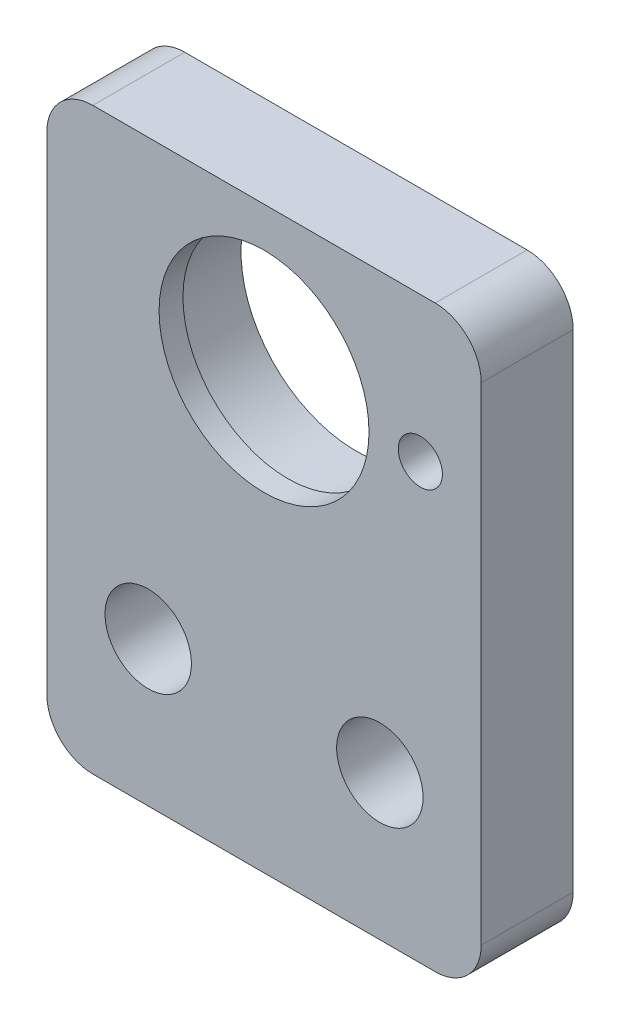
ISO-10303-21;
HEADER;
FILE_DESCRIPTION(('STEP AP214'),'2;1');
FILE_NAME('part.step','',(''),(''),'','','');
FILE_SCHEMA(('AUTOMOTIVE_DESIGN { 1 0 10303 214 1 1 1 1 }'));
ENDSEC;
DATA;
#1=APPLICATION_CONTEXT('core data for automotive mechanical design processes');
#2=APPLICATION_PROTOCOL_DEFINITION('international standard','automotive_design',2000,#1);
#3=PRODUCT_CONTEXT('',#1,'mechanical');
#4=PRODUCT('Part','Part','',(#3));
#5=PRODUCT_RELATED_PRODUCT_CATEGORY('part','',(#4));
#6=PRODUCT_DEFINITION_FORMATION('','',#4);
#7=PRODUCT_DEFINITION_CONTEXT('part definition',#1,'design');
#8=PRODUCT_DEFINITION('design','',#6,#7);
#9=PRODUCT_DEFINITION_SHAPE('','',#8);
#10=(LENGTH_UNIT() NAMED_UNIT(*) SI_UNIT(.MILLI.,.METRE.));
#11=(NAMED_UNIT(*) PLANE_ANGLE_UNIT() SI_UNIT($,.RADIAN.));
#12=(NAMED_UNIT(*) SI_UNIT($,.STERADIAN.) SOLID_ANGLE_UNIT());
#13=UNCERTAINTY_MEASURE_WITH_UNIT(LENGTH_MEASURE(1.E-05),#10,'distance_accuracy_value','');
#14=(GEOMETRIC_REPRESENTATION_CONTEXT(3) GLOBAL_UNCERTAINTY_ASSIGNED_CONTEXT((#13)) GLOBAL_UNIT_ASSIGNED_CONTEXT((#10,
#11,#12)) REPRESENTATION_CONTEXT('',''));
#15=CARTESIAN_POINT('',(0.,0.,0.));
#16=DIRECTION('',(0.,0.,1.));
#17=DIRECTION('',(1.,0.,0.));
#18=AXIS2_PLACEMENT_3D('',#15,#16,#17);
#19=CARTESIAN_POINT('',(142.99170158778,150.001559901278,0.));
#20=DIRECTION('',(0.,0.,1.));
#21=DIRECTION('',(1.,0.,0.));
#22=AXIS2_PLACEMENT_3D('',#19,#20,#21);
#23=PLANE('',#22);
#24=DIRECTION('',(0.,1.,0.));
#25=VECTOR('',#24,1.);
#26=CARTESIAN_POINT('',(157.99170158772,150.001559901278,0.));
#27=LINE('',#26,#25);
#28=CARTESIAN_POINT('',(157.99170158772,172.2088542227,0.));
#29=VERTEX_POINT('',#28);
#30=CARTESIAN_POINT('',(157.99170158772,205.85885422254,0.));
#31=VERTEX_POINT('',#30);
#32=EDGE_CURVE('E142',#29,#31,#27,.T.);
#33=ORIENTED_EDGE('',*,*,#32,.F.);
#34=CARTESIAN_POINT('',(154.81670158772,172.2088542227,0.));
#35=DIRECTION('',(0.,0.,1.));
#36=DIRECTION('',(1.,0.,0.));
#37=AXIS2_PLACEMENT_3D('',#34,#35,#36);
#38=CIRCLE('',#37,3.17500000000001);
#39=CARTESIAN_POINT('',(154.81670158772,169.0338542227,0.));
#40=VERTEX_POINT('',#39);
#41=EDGE_CURVE('E83',#40,#29,#38,.T.);
#42=ORIENTED_EDGE('',*,*,#41,.F.);
#43=DIRECTION('',(1.,0.,0.));
#44=VECTOR('',#43,1.);
#45=CARTESIAN_POINT('',(142.99170158778,169.0338542227,0.));
#46=LINE('',#45,#44);
#47=CARTESIAN_POINT('',(131.16670158784,169.0338542227,0.));
#48=VERTEX_POINT('',#47);
#49=EDGE_CURVE('E77',#48,#40,#46,.T.);
#50=ORIENTED_EDGE('',*,*,#49,.F.);
#51=CARTESIAN_POINT('',(131.16670158784,172.2088542227,0.));
#52=DIRECTION('',(0.,0.,1.));
#53=DIRECTION('',(1.,0.,0.));
#54=AXIS2_PLACEMENT_3D('',#51,#52,#53);
#55=CIRCLE('',#54,3.17500000000001);
#56=CARTESIAN_POINT('',(127.99170158784,172.2088542227,0.));
#57=VERTEX_POINT('',#56);
#58=EDGE_CURVE('E119',#57,#48,#55,.T.);
#59=ORIENTED_EDGE('',*,*,#58,.F.);
#60=DIRECTION('',(0.,-1.,0.));
#61=VECTOR('',#60,1.);
#62=CARTESIAN_POINT('',(127.99170158784,150.001559901278,0.));
#63=LINE('',#62,#61);
#64=CARTESIAN_POINT('',(127.99170158784,205.85885422254,0.));
#65=VERTEX_POINT('',#64);
#66=EDGE_CURVE('E151',#65,#57,#63,.T.);
#67=ORIENTED_EDGE('',*,*,#66,.F.);
#68=CARTESIAN_POINT('',(131.16670158784,205.85885422254,0.));
#69=DIRECTION('',(0.,0.,1.));
#70=DIRECTION('',(1.,0.,0.));
#71=AXIS2_PLACEMENT_3D('',#68,#69,#70);
#72=CIRCLE('',#71,3.175);
#73=CARTESIAN_POINT('',(131.16670158784,209.03385422254,0.));
#74=VERTEX_POINT('',#73);
#75=EDGE_CURVE('E149',#74,#65,#72,.T.);
#76=ORIENTED_EDGE('',*,*,#75,.F.);
#77=DIRECTION('',(-1.,0.,0.));
#78=VECTOR('',#77,1.);
#79=CARTESIAN_POINT('',(142.99170158778,209.03385422254,0.));
#80=LINE('',#79,#78);
#81=CARTESIAN_POINT('',(154.81670158772,209.03385422254,0.));
#82=VERTEX_POINT('',#81);
#83=EDGE_CURVE('E147',#82,#74,#80,.T.);
#84=ORIENTED_EDGE('',*,*,#83,.F.);
#85=CARTESIAN_POINT('',(154.81670158772,205.85885422254,0.));
#86=DIRECTION('',(0.,0.,1.));
#87=DIRECTION('',(1.,0.,0.));
#88=AXIS2_PLACEMENT_3D('',#85,#86,#87);
#89=CIRCLE('',#88,3.175);
#90=EDGE_CURVE('E145',#31,#82,#89,.T.);
#91=ORIENTED_EDGE('',*,*,#90,.F.);
#92=EDGE_LOOP('',(#33,#42,#50,#59,#67,#76,#84,#91));
#93=FACE_BOUND('',#92,.T.);
#94=CARTESIAN_POINT('',(153.78670158778,199.03385422258,0.));
#95=DIRECTION('',(0.,0.,1.));
#96=DIRECTION('',(1.,0.,0.));
#97=AXIS2_PLACEMENT_3D('',#94,#95,#96);
#98=CIRCLE('',#97,1.524);
#99=CARTESIAN_POINT('',(155.31070158778,199.03385422258,0.));
#100=VERTEX_POINT('',#99);
#101=EDGE_CURVE('E139',#100,#100,#98,.T.);
#102=ORIENTED_EDGE('',*,*,#101,.T.);
#103=EDGE_LOOP('',(#102));
#104=FACE_BOUND('',#103,.T.);
#105=CARTESIAN_POINT('',(134.99170158832,179.03385422266,0.));
#106=DIRECTION('',(0.,0.,1.));
#107=DIRECTION('',(1.,0.,0.));
#108=AXIS2_PLACEMENT_3D('',#105,#106,#107);
#109=CIRCLE('',#108,2.9845);
#110=CARTESIAN_POINT('',(137.97620158832,179.03385422266,0.));
#111=VERTEX_POINT('',#110);
#112=EDGE_CURVE('E135',#111,#111,#109,.T.);
#113=ORIENTED_EDGE('',*,*,#112,.T.);
#114=EDGE_LOOP('',(#113));
#115=FACE_BOUND('',#114,.T.);
#116=CARTESIAN_POINT('',(150.99170158724,179.03385422266,0.));
#117=DIRECTION('',(0.,0.,1.));
#118=DIRECTION('',(1.,0.,0.));
#119=AXIS2_PLACEMENT_3D('',#116,#117,#118);
#120=CIRCLE('',#119,2.9845);
#121=CARTESIAN_POINT('',(153.97620158724,179.03385422266,0.));
#122=VERTEX_POINT('',#121);
#123=EDGE_CURVE('E132',#122,#122,#120,.T.);
#124=ORIENTED_EDGE('',*,*,#123,.T.);
#125=EDGE_LOOP('',(#124));
#126=FACE_BOUND('',#125,.T.);
#127=CARTESIAN_POINT('',(142.99170158778,199.03385422258,0.));
#128=DIRECTION('',(0.,0.,1.));
#129=DIRECTION('',(1.,0.,0.));
#130=AXIS2_PLACEMENT_3D('',#127,#128,#129);
#131=CIRCLE('',#130,7.93750000000001);
#132=CARTESIAN_POINT('',(150.92920158778,199.03385422258,0.));
#133=VERTEX_POINT('',#132);
#134=EDGE_CURVE('E198',#133,#133,#131,.T.);
#135=ORIENTED_EDGE('',*,*,#134,.T.);
#136=EDGE_LOOP('',(#135));
#137=FACE_BOUND('',#136,.T.);
#138=ADVANCED_FACE('F31',(#93,#104,#115,#126,#137),#23,.F.);
#139=CARTESIAN_POINT('',(157.99170158772,150.001559901278,6.35));
#140=DIRECTION('',(-1.,0.,0.));
#141=DIRECTION('',(0.,0.,1.));
#142=AXIS2_PLACEMENT_3D('',#139,#140,#141);
#143=PLANE('',#142);
#144=ORIENTED_EDGE('',*,*,#32,.T.);
#145=DIRECTION('',(0.,0.,-1.));
#146=VECTOR('',#145,1.);
#147=CARTESIAN_POINT('',(157.99170158772,205.85885422254,6.35));
#148=LINE('',#147,#146);
#149=CARTESIAN_POINT('',(157.99170158772,205.85885422254,6.35));
#150=VERTEX_POINT('',#149);
#151=EDGE_CURVE('E11',#150,#31,#148,.T.);
#152=ORIENTED_EDGE('',*,*,#151,.F.);
#153=DIRECTION('',(0.,1.,0.));
#154=VECTOR('',#153,1.);
#155=CARTESIAN_POINT('',(157.99170158772,150.001559901278,6.35));
#156=LINE('',#155,#154);
#157=CARTESIAN_POINT('',(157.99170158772,172.2088542227,6.35));
#158=VERTEX_POINT('',#157);
#159=EDGE_CURVE('E188',#158,#150,#156,.T.);
#160=ORIENTED_EDGE('',*,*,#159,.F.);
#161=DIRECTION('',(0.,0.,-1.));
#162=VECTOR('',#161,1.);
#163=CARTESIAN_POINT('',(157.99170158772,172.2088542227,6.35));
#164=LINE('',#163,#162);
#165=EDGE_CURVE('E131',#158,#29,#164,.T.);
#166=ORIENTED_EDGE('',*,*,#165,.T.);
#167=EDGE_LOOP('',(#144,#152,#160,#166));
#168=FACE_BOUND('',#167,.T.);
#169=ADVANCED_FACE('F228',(#168),#143,.F.);
#170=CARTESIAN_POINT('',(154.81670158772,205.85885422254,6.35));
#171=DIRECTION('',(0.,0.,-1.));
#172=DIRECTION('',(-1.,0.,0.));
#173=AXIS2_PLACEMENT_3D('',#170,#171,#172);
#174=CYLINDRICAL_SURFACE('',#173,3.175);
#175=ORIENTED_EDGE('',*,*,#90,.T.);
#176=DIRECTION('',(0.,0.,-1.));
#177=VECTOR('',#176,1.);
#178=CARTESIAN_POINT('',(154.81670158772,209.03385422254,6.35));
#179=LINE('',#178,#177);
#180=CARTESIAN_POINT('',(154.81670158772,209.03385422254,6.35));
#181=VERTEX_POINT('',#180);
#182=EDGE_CURVE('E40',#181,#82,#179,.T.);
#183=ORIENTED_EDGE('',*,*,#182,.F.);
#184=CARTESIAN_POINT('',(154.81670158772,205.85885422254,6.35));
#185=DIRECTION('',(0.,0.,1.));
#186=DIRECTION('',(1.,0.,0.));
#187=AXIS2_PLACEMENT_3D('',#184,#185,#186);
#188=CIRCLE('',#187,3.175);
#189=EDGE_CURVE('E91',#150,#181,#188,.T.);
#190=ORIENTED_EDGE('',*,*,#189,.F.);
#191=ORIENTED_EDGE('',*,*,#151,.T.);
#192=EDGE_LOOP('',(#175,#183,#190,#191));
#193=FACE_BOUND('',#192,.T.);
#194=ADVANCED_FACE('F232',(#193),#174,.T.);
#195=CARTESIAN_POINT('',(142.99170158778,209.03385422254,6.35));
#196=DIRECTION('',(0.,-1.,0.));
#197=DIRECTION('',(0.,0.,-1.));
#198=AXIS2_PLACEMENT_3D('',#195,#196,#197);
#199=PLANE('',#198);
#200=ORIENTED_EDGE('',*,*,#83,.T.);
#201=DIRECTION('',(0.,0.,-1.));
#202=VECTOR('',#201,1.);
#203=CARTESIAN_POINT('',(131.16670158784,209.03385422254,6.35));
#204=LINE('',#203,#202);
#205=CARTESIAN_POINT('',(131.16670158784,209.03385422254,6.35));
#206=VERTEX_POINT('',#205);
#207=EDGE_CURVE('E163',#206,#74,#204,.T.);
#208=ORIENTED_EDGE('',*,*,#207,.F.);
#209=DIRECTION('',(-1.,0.,0.));
#210=VECTOR('',#209,1.);
#211=CARTESIAN_POINT('',(142.99170158778,209.03385422254,6.35));
#212=LINE('',#211,#210);
#213=EDGE_CURVE('E171',#181,#206,#212,.T.);
#214=ORIENTED_EDGE('',*,*,#213,.F.);
#215=ORIENTED_EDGE('',*,*,#182,.T.);
#216=EDGE_LOOP('',(#200,#208,#214,#215));
#217=FACE_BOUND('',#216,.T.);
#218=ADVANCED_FACE('F169',(#217),#199,.F.);
#219=CARTESIAN_POINT('',(131.16670158784,205.85885422254,6.35));
#220=DIRECTION('',(0.,0.,-1.));
#221=DIRECTION('',(-1.,0.,0.));
#222=AXIS2_PLACEMENT_3D('',#219,#220,#221);
#223=CYLINDRICAL_SURFACE('',#222,3.175);
#224=ORIENTED_EDGE('',*,*,#75,.T.);
#225=DIRECTION('',(0.,0.,-1.));
#226=VECTOR('',#225,1.);
#227=CARTESIAN_POINT('',(127.99170158784,205.85885422254,6.35));
#228=LINE('',#227,#226);
#229=CARTESIAN_POINT('',(127.99170158784,205.85885422254,6.35));
#230=VERTEX_POINT('',#229);
#231=EDGE_CURVE('E160',#230,#65,#228,.T.);
#232=ORIENTED_EDGE('',*,*,#231,.F.);
#233=CARTESIAN_POINT('',(131.16670158784,205.85885422254,6.35));
#234=DIRECTION('',(0.,0.,1.));
#235=DIRECTION('',(1.,0.,0.));
#236=AXIS2_PLACEMENT_3D('',#233,#234,#235);
#237=CIRCLE('',#236,3.175);
#238=EDGE_CURVE('E183',#206,#230,#237,.T.);
#239=ORIENTED_EDGE('',*,*,#238,.F.);
#240=ORIENTED_EDGE('',*,*,#207,.T.);
#241=EDGE_LOOP('',(#224,#232,#239,#240));
#242=FACE_BOUND('',#241,.T.);
#243=ADVANCED_FACE('F179',(#242),#223,.T.);
#244=CARTESIAN_POINT('',(127.99170158784,150.001559901278,6.35));
#245=DIRECTION('',(1.,0.,0.));
#246=DIRECTION('',(0.,0.,-1.));
#247=AXIS2_PLACEMENT_3D('',#244,#245,#246);
#248=PLANE('',#247);
#249=ORIENTED_EDGE('',*,*,#66,.T.);
#250=DIRECTION('',(0.,0.,-1.));
#251=VECTOR('',#250,1.);
#252=CARTESIAN_POINT('',(127.99170158784,172.2088542227,6.35));
#253=LINE('',#252,#251);
#254=CARTESIAN_POINT('',(127.99170158784,172.2088542227,6.35));
#255=VERTEX_POINT('',#254);
#256=EDGE_CURVE('E120',#255,#57,#253,.T.);
#257=ORIENTED_EDGE('',*,*,#256,.F.);
#258=DIRECTION('',(0.,-1.,0.));
#259=VECTOR('',#258,1.);
#260=CARTESIAN_POINT('',(127.99170158784,150.001559901278,6.35));
#261=LINE('',#260,#259);
#262=EDGE_CURVE('E111',#230,#255,#261,.T.);
#263=ORIENTED_EDGE('',*,*,#262,.F.);
#264=ORIENTED_EDGE('',*,*,#231,.T.);
#265=EDGE_LOOP('',(#249,#257,#263,#264));
#266=FACE_BOUND('',#265,.T.);
#267=ADVANCED_FACE('F182',(#266),#248,.F.);
#268=CARTESIAN_POINT('',(131.16670158784,172.2088542227,6.35));
#269=DIRECTION('',(0.,0.,-1.));
#270=DIRECTION('',(-1.,0.,0.));
#271=AXIS2_PLACEMENT_3D('',#268,#269,#270);
#272=CYLINDRICAL_SURFACE('',#271,3.17500000000001);
#273=ORIENTED_EDGE('',*,*,#58,.T.);
#274=DIRECTION('',(0.,0.,-1.));
#275=VECTOR('',#274,1.);
#276=CARTESIAN_POINT('',(131.16670158784,169.0338542227,6.35));
#277=LINE('',#276,#275);
#278=CARTESIAN_POINT('',(131.16670158784,169.0338542227,6.35));
#279=VERTEX_POINT('',#278);
#280=EDGE_CURVE('E116',#279,#48,#277,.T.);
#281=ORIENTED_EDGE('',*,*,#280,.F.);
#282=CARTESIAN_POINT('',(131.16670158784,172.2088542227,6.35));
#283=DIRECTION('',(0.,0.,1.));
#284=DIRECTION('',(1.,0.,0.));
#285=AXIS2_PLACEMENT_3D('',#282,#283,#284);
#286=CIRCLE('',#285,3.17500000000001);
#287=EDGE_CURVE('E104',#255,#279,#286,.T.);
#288=ORIENTED_EDGE('',*,*,#287,.F.);
#289=ORIENTED_EDGE('',*,*,#256,.T.);
#290=EDGE_LOOP('',(#273,#281,#288,#289));
#291=FACE_BOUND('',#290,.T.);
#292=ADVANCED_FACE('F117',(#291),#272,.T.);
#293=CARTESIAN_POINT('',(142.99170158778,169.0338542227,6.35));
#294=DIRECTION('',(0.,1.,0.));
#295=DIRECTION('',(0.,0.,1.));
#296=AXIS2_PLACEMENT_3D('',#293,#294,#295);
#297=PLANE('',#296);
#298=ORIENTED_EDGE('',*,*,#49,.T.);
#299=DIRECTION('',(0.,0.,-1.));
#300=VECTOR('',#299,1.);
#301=CARTESIAN_POINT('',(154.81670158772,169.0338542227,6.35));
#302=LINE('',#301,#300);
#303=CARTESIAN_POINT('',(154.81670158772,169.0338542227,6.35));
#304=VERTEX_POINT('',#303);
#305=EDGE_CURVE('E121',#304,#40,#302,.T.);
#306=ORIENTED_EDGE('',*,*,#305,.F.);
#307=DIRECTION('',(1.,0.,0.));
#308=VECTOR('',#307,1.);
#309=CARTESIAN_POINT('',(142.99170158778,169.0338542227,6.35));
#310=LINE('',#309,#308);
#311=EDGE_CURVE('E109',#279,#304,#310,.T.);
#312=ORIENTED_EDGE('',*,*,#311,.F.);
#313=ORIENTED_EDGE('',*,*,#280,.T.);
#314=EDGE_LOOP('',(#298,#306,#312,#313));
#315=FACE_BOUND('',#314,.T.);
#316=ADVANCED_FACE('F123',(#315),#297,.F.);
#317=CARTESIAN_POINT('',(154.81670158772,172.2088542227,6.35));
#318=DIRECTION('',(0.,0.,-1.));
#319=DIRECTION('',(-1.,0.,0.));
#320=AXIS2_PLACEMENT_3D('',#317,#318,#319);
#321=CYLINDRICAL_SURFACE('',#320,3.17500000000001);
#322=ORIENTED_EDGE('',*,*,#41,.T.);
#323=ORIENTED_EDGE('',*,*,#165,.F.);
#324=CARTESIAN_POINT('',(154.81670158772,172.2088542227,6.35));
#325=DIRECTION('',(0.,0.,1.));
#326=DIRECTION('',(1.,0.,0.));
#327=AXIS2_PLACEMENT_3D('',#324,#325,#326);
#328=CIRCLE('',#327,3.17500000000001);
#329=EDGE_CURVE('E48',#304,#158,#328,.T.);
#330=ORIENTED_EDGE('',*,*,#329,.F.);
#331=ORIENTED_EDGE('',*,*,#305,.T.);
#332=EDGE_LOOP('',(#322,#323,#330,#331));
#333=FACE_BOUND('',#332,.T.);
#334=ADVANCED_FACE('F236',(#333),#321,.T.);
#335=CARTESIAN_POINT('',(153.78670158778,199.03385422258,6.35));
#336=DIRECTION('',(0.,0.,-1.));
#337=DIRECTION('',(-1.,0.,0.));
#338=AXIS2_PLACEMENT_3D('',#335,#336,#337);
#339=CYLINDRICAL_SURFACE('',#338,1.524);
#340=CARTESIAN_POINT('',(153.78670158778,199.03385422258,6.35));
#341=DIRECTION('',(0.,0.,1.));
#342=DIRECTION('',(1.,0.,0.));
#343=AXIS2_PLACEMENT_3D('',#340,#341,#342);
#344=CIRCLE('',#343,1.524);
#345=CARTESIAN_POINT('',(155.31070158778,199.03385422258,6.35));
#346=VERTEX_POINT('',#345);
#347=EDGE_CURVE('E190',#346,#346,#344,.T.);
#348=ORIENTED_EDGE('',*,*,#347,.T.);
#349=EDGE_LOOP('',(#348));
#350=FACE_BOUND('',#349,.T.);
#351=ORIENTED_EDGE('',*,*,#101,.F.);
#352=EDGE_LOOP('',(#351));
#353=FACE_BOUND('',#352,.T.);
#354=ADVANCED_FACE('F239',(#350,#353),#339,.F.);
#355=CARTESIAN_POINT('',(134.99170158832,179.03385422266,6.35));
#356=DIRECTION('',(0.,0.,-1.));
#357=DIRECTION('',(-1.,0.,0.));
#358=AXIS2_PLACEMENT_3D('',#355,#356,#357);
#359=CYLINDRICAL_SURFACE('',#358,2.9845);
#360=CARTESIAN_POINT('',(134.99170158832,179.03385422266,6.35));
#361=DIRECTION('',(0.,0.,1.));
#362=DIRECTION('',(1.,0.,0.));
#363=AXIS2_PLACEMENT_3D('',#360,#361,#362);
#364=CIRCLE('',#363,2.9845);
#365=CARTESIAN_POINT('',(137.97620158832,179.03385422266,6.35));
#366=VERTEX_POINT('',#365);
#367=EDGE_CURVE('E193',#366,#366,#364,.T.);
#368=ORIENTED_EDGE('',*,*,#367,.T.);
#369=EDGE_LOOP('',(#368));
#370=FACE_BOUND('',#369,.T.);
#371=ORIENTED_EDGE('',*,*,#112,.F.);
#372=EDGE_LOOP('',(#371));
#373=FACE_BOUND('',#372,.T.);
#374=ADVANCED_FACE('F253',(#370,#373),#359,.F.);
#375=CARTESIAN_POINT('',(150.99170158724,179.03385422266,6.35));
#376=DIRECTION('',(0.,0.,-1.));
#377=DIRECTION('',(-1.,0.,0.));
#378=AXIS2_PLACEMENT_3D('',#375,#376,#377);
#379=CYLINDRICAL_SURFACE('',#378,2.9845);
#380=CARTESIAN_POINT('',(150.99170158724,179.03385422266,6.35));
#381=DIRECTION('',(0.,0.,1.));
#382=DIRECTION('',(1.,0.,0.));
#383=AXIS2_PLACEMENT_3D('',#380,#381,#382);
#384=CIRCLE('',#383,2.9845);
#385=CARTESIAN_POINT('',(153.97620158724,179.03385422266,6.35));
#386=VERTEX_POINT('',#385);
#387=EDGE_CURVE('E156',#386,#386,#384,.T.);
#388=ORIENTED_EDGE('',*,*,#387,.T.);
#389=EDGE_LOOP('',(#388));
#390=FACE_BOUND('',#389,.T.);
#391=ORIENTED_EDGE('',*,*,#123,.F.);
#392=EDGE_LOOP('',(#391));
#393=FACE_BOUND('',#392,.T.);
#394=ADVANCED_FACE('F33',(#390,#393),#379,.F.);
#395=CARTESIAN_POINT('',(142.99170158778,199.03385422258,6.35));
#396=DIRECTION('',(0.,0.,-1.));
#397=DIRECTION('',(-1.,0.,0.));
#398=AXIS2_PLACEMENT_3D('',#395,#396,#397);
#399=CYLINDRICAL_SURFACE('',#398,7.25000000085998);
#400=CARTESIAN_POINT('',(142.99170158778,199.03385422258,4.699));
#401=DIRECTION('',(0.,0.,1.));
#402=DIRECTION('',(1.,0.,0.));
#403=AXIS2_PLACEMENT_3D('',#400,#401,#402);
#404=CIRCLE('',#403,7.25000000085998);
#405=CARTESIAN_POINT('',(150.24170158864,199.03385422258,4.699));
#406=VERTEX_POINT('',#405);
#407=EDGE_CURVE('E201',#406,#406,#404,.T.);
#408=ORIENTED_EDGE('',*,*,#407,.F.);
#409=EDGE_LOOP('',(#408));
#410=FACE_BOUND('',#409,.T.);
#411=CARTESIAN_POINT('',(142.99170158778,199.03385422258,6.35));
#412=DIRECTION('',(0.,0.,1.));
#413=DIRECTION('',(1.,0.,0.));
#414=AXIS2_PLACEMENT_3D('',#411,#412,#413);
#415=CIRCLE('',#414,7.25000000085998);
#416=CARTESIAN_POINT('',(150.24170158864,199.03385422258,6.35));
#417=VERTEX_POINT('',#416);
#418=EDGE_CURVE('E125',#417,#417,#415,.T.);
#419=ORIENTED_EDGE('',*,*,#418,.T.);
#420=EDGE_LOOP('',(#419));
#421=FACE_BOUND('',#420,.T.);
#422=ADVANCED_FACE('F210',(#410,#421),#399,.F.);
#423=CARTESIAN_POINT('',(142.99170158778,150.001559901278,6.35));
#424=DIRECTION('',(0.,0.,1.));
#425=DIRECTION('',(1.,0.,0.));
#426=AXIS2_PLACEMENT_3D('',#423,#424,#425);
#427=PLANE('',#426);
#428=ORIENTED_EDGE('',*,*,#387,.F.);
#429=EDGE_LOOP('',(#428));
#430=FACE_BOUND('',#429,.T.);
#431=ORIENTED_EDGE('',*,*,#367,.F.);
#432=EDGE_LOOP('',(#431));
#433=FACE_BOUND('',#432,.T.);
#434=ORIENTED_EDGE('',*,*,#347,.F.);
#435=EDGE_LOOP('',(#434));
#436=FACE_BOUND('',#435,.T.);
#437=ORIENTED_EDGE('',*,*,#159,.T.);
#438=ORIENTED_EDGE('',*,*,#189,.T.);
#439=ORIENTED_EDGE('',*,*,#213,.T.);
#440=ORIENTED_EDGE('',*,*,#238,.T.);
#441=ORIENTED_EDGE('',*,*,#262,.T.);
#442=ORIENTED_EDGE('',*,*,#287,.T.);
#443=ORIENTED_EDGE('',*,*,#311,.T.);
#444=ORIENTED_EDGE('',*,*,#329,.T.);
#445=EDGE_LOOP('',(#437,#438,#439,#440,#441,#442,#443,#444));
#446=FACE_BOUND('',#445,.T.);
#447=ORIENTED_EDGE('',*,*,#418,.F.);
#448=EDGE_LOOP('',(#447));
#449=FACE_BOUND('',#448,.T.);
#450=ADVANCED_FACE('F106',(#430,#433,#436,#446,#449),#427,.T.);
#451=CARTESIAN_POINT('',(142.99170158778,199.03385422258,4.699));
#452=DIRECTION('',(0.,0.,-1.));
#453=DIRECTION('',(-1.,0.,0.));
#454=AXIS2_PLACEMENT_3D('',#451,#452,#453);
#455=CYLINDRICAL_SURFACE('',#454,7.93750000000001);
#456=CARTESIAN_POINT('',(142.99170158778,199.03385422258,4.699));
#457=DIRECTION('',(0.,0.,1.));
#458=DIRECTION('',(1.,0.,0.));
#459=AXIS2_PLACEMENT_3D('',#456,#457,#458);
#460=CIRCLE('',#459,7.93750000000001);
#461=CARTESIAN_POINT('',(150.92920158778,199.03385422258,4.699));
#462=VERTEX_POINT('',#461);
#463=EDGE_CURVE('E136',#462,#462,#460,.T.);
#464=ORIENTED_EDGE('',*,*,#463,.T.);
#465=EDGE_LOOP('',(#464));
#466=FACE_BOUND('',#465,.T.);
#467=ORIENTED_EDGE('',*,*,#134,.F.);
#468=EDGE_LOOP('',(#467));
#469=FACE_BOUND('',#468,.T.);
#470=ADVANCED_FACE('F216',(#466,#469),#455,.F.);
#471=CARTESIAN_POINT('',(142.99170158778,150.001559901278,4.699));
#472=DIRECTION('',(0.,0.,1.));
#473=DIRECTION('',(1.,0.,0.));
#474=AXIS2_PLACEMENT_3D('',#471,#472,#473);
#475=PLANE('',#474);
#476=ORIENTED_EDGE('',*,*,#407,.T.);
#477=EDGE_LOOP('',(#476));
#478=FACE_BOUND('',#477,.T.);
#479=ORIENTED_EDGE('',*,*,#463,.F.);
#480=EDGE_LOOP('',(#479));
#481=FACE_BOUND('',#480,.T.);
#482=ADVANCED_FACE('F207',(#478,#481),#475,.F.);
#483=CLOSED_SHELL('',(#138,#169,#194,#218,#243,#267,#292,#316,#334,#354,#374,#394,#422,#450,
#470,#482));
#484=MANIFOLD_SOLID_BREP('B2',#483);
#485=ADVANCED_BREP_SHAPE_REPRESENTATION('',(#18,#484),#14);
#486=SHAPE_DEFINITION_REPRESENTATION(#9,#485);
ENDSEC;
END-ISO-10303-21;
